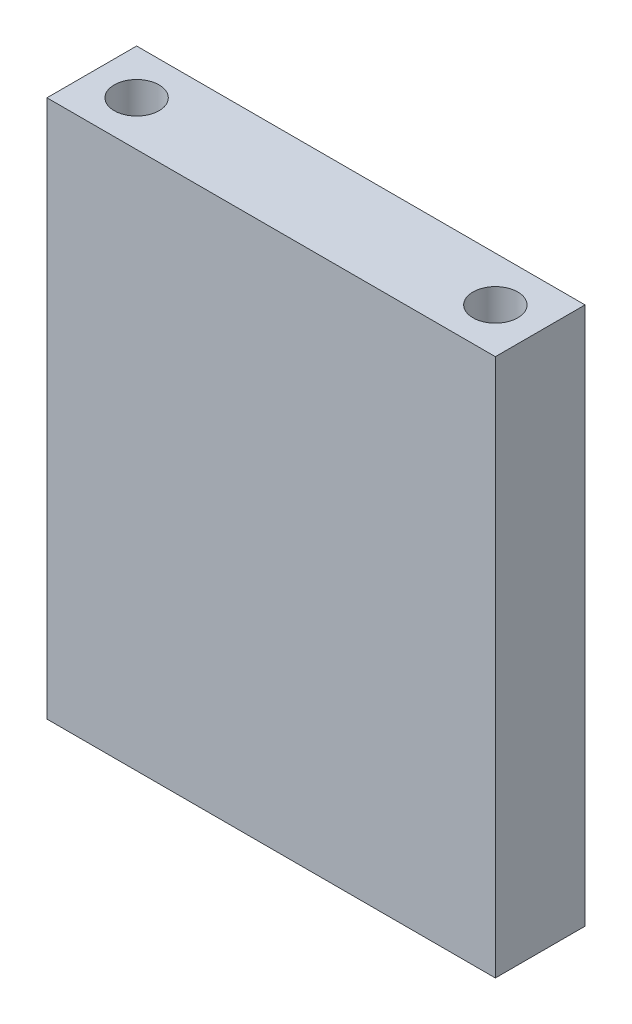
ISO-10303-21;
HEADER;
FILE_DESCRIPTION(('STEP AP214'),'2;1');
FILE_NAME('part.step','',(''),(''),'','','');
FILE_SCHEMA(('AUTOMOTIVE_DESIGN { 1 0 10303 214 1 1 1 1 }'));
ENDSEC;
DATA;
#1=APPLICATION_CONTEXT('core data for automotive mechanical design processes');
#2=APPLICATION_PROTOCOL_DEFINITION('international standard','automotive_design',2000,#1);
#3=PRODUCT_CONTEXT('',#1,'mechanical');
#4=PRODUCT('Part','Part','',(#3));
#5=PRODUCT_RELATED_PRODUCT_CATEGORY('part','',(#4));
#6=PRODUCT_DEFINITION_FORMATION('','',#4);
#7=PRODUCT_DEFINITION_CONTEXT('part definition',#1,'design');
#8=PRODUCT_DEFINITION('design','',#6,#7);
#9=PRODUCT_DEFINITION_SHAPE('','',#8);
#10=(LENGTH_UNIT() NAMED_UNIT(*) SI_UNIT(.MILLI.,.METRE.));
#11=(NAMED_UNIT(*) PLANE_ANGLE_UNIT() SI_UNIT($,.RADIAN.));
#12=(NAMED_UNIT(*) SI_UNIT($,.STERADIAN.) SOLID_ANGLE_UNIT());
#13=UNCERTAINTY_MEASURE_WITH_UNIT(LENGTH_MEASURE(1.E-05),#10,'distance_accuracy_value','');
#14=(GEOMETRIC_REPRESENTATION_CONTEXT(3) GLOBAL_UNCERTAINTY_ASSIGNED_CONTEXT((#13)) GLOBAL_UNIT_ASSIGNED_CONTEXT((#10,
#11,#12)) REPRESENTATION_CONTEXT('',''));
#15=CARTESIAN_POINT('',(0.,0.,0.));
#16=DIRECTION('',(0.,0.,1.));
#17=DIRECTION('',(1.,0.,0.));
#18=AXIS2_PLACEMENT_3D('',#15,#16,#17);
#19=CARTESIAN_POINT('',(12.5,15.,5.));
#20=DIRECTION('',(-1.,0.,0.));
#21=DIRECTION('',(0.,-1.,0.));
#22=AXIS2_PLACEMENT_3D('',#19,#20,#21);
#23=PLANE('',#22);
#24=DIRECTION('',(0.,1.,0.));
#25=VECTOR('',#24,1.);
#26=CARTESIAN_POINT('',(12.5,15.,0.));
#27=LINE('',#26,#25);
#28=CARTESIAN_POINT('',(12.5,-15.,0.));
#29=VERTEX_POINT('',#28);
#30=CARTESIAN_POINT('',(12.5,15.,0.));
#31=VERTEX_POINT('',#30);
#32=EDGE_CURVE('E92',#29,#31,#27,.T.);
#33=ORIENTED_EDGE('',*,*,#32,.T.);
#34=DIRECTION('',(0.,0.,-1.));
#35=VECTOR('',#34,1.);
#36=CARTESIAN_POINT('',(12.5,15.,5.));
#37=LINE('',#36,#35);
#38=CARTESIAN_POINT('',(12.5,15.,5.));
#39=VERTEX_POINT('',#38);
#40=EDGE_CURVE('E11',#39,#31,#37,.T.);
#41=ORIENTED_EDGE('',*,*,#40,.F.);
#42=DIRECTION('',(0.,1.,0.));
#43=VECTOR('',#42,1.);
#44=CARTESIAN_POINT('',(12.5,15.,5.));
#45=LINE('',#44,#43);
#46=CARTESIAN_POINT('',(12.5,-15.,5.));
#47=VERTEX_POINT('',#46);
#48=EDGE_CURVE('E93',#47,#39,#45,.T.);
#49=ORIENTED_EDGE('',*,*,#48,.F.);
#50=DIRECTION('',(0.,0.,-1.));
#51=VECTOR('',#50,1.);
#52=CARTESIAN_POINT('',(12.5,-15.,5.));
#53=LINE('',#52,#51);
#54=EDGE_CURVE('E99',#47,#29,#53,.T.);
#55=ORIENTED_EDGE('',*,*,#54,.T.);
#56=EDGE_LOOP('',(#33,#41,#49,#55));
#57=FACE_BOUND('',#56,.T.);
#58=ADVANCED_FACE('F17',(#57),#23,.F.);
#59=CARTESIAN_POINT('',(-12.5,15.,5.));
#60=DIRECTION('',(0.,-1.,0.));
#61=DIRECTION('',(0.,0.,-1.));
#62=AXIS2_PLACEMENT_3D('',#59,#60,#61);
#63=PLANE('',#62);
#64=CARTESIAN_POINT('',(-10.,15.,2.5));
#65=DIRECTION('',(0.,1.,0.));
#66=DIRECTION('',(0.,0.,1.));
#67=AXIS2_PLACEMENT_3D('',#64,#65,#66);
#68=CIRCLE('',#67,1.25);
#69=CARTESIAN_POINT('',(-10.,15.,3.75));
#70=VERTEX_POINT('',#69);
#71=EDGE_CURVE('E82',#70,#70,#68,.T.);
#72=ORIENTED_EDGE('',*,*,#71,.F.);
#73=EDGE_LOOP('',(#72));
#74=FACE_BOUND('',#73,.T.);
#75=CARTESIAN_POINT('',(10.,15.,2.5));
#76=DIRECTION('',(0.,1.,0.));
#77=DIRECTION('',(0.,0.,1.));
#78=AXIS2_PLACEMENT_3D('',#75,#76,#77);
#79=CIRCLE('',#78,1.25);
#80=CARTESIAN_POINT('',(10.,15.,3.75));
#81=VERTEX_POINT('',#80);
#82=EDGE_CURVE('E81',#81,#81,#79,.T.);
#83=ORIENTED_EDGE('',*,*,#82,.F.);
#84=EDGE_LOOP('',(#83));
#85=FACE_BOUND('',#84,.T.);
#86=DIRECTION('',(-1.,0.,0.));
#87=VECTOR('',#86,1.);
#88=CARTESIAN_POINT('',(-12.5,15.,0.));
#89=LINE('',#88,#87);
#90=CARTESIAN_POINT('',(-12.5,15.,0.));
#91=VERTEX_POINT('',#90);
#92=EDGE_CURVE('E102',#31,#91,#89,.T.);
#93=ORIENTED_EDGE('',*,*,#92,.T.);
#94=DIRECTION('',(0.,0.,-1.));
#95=VECTOR('',#94,1.);
#96=CARTESIAN_POINT('',(-12.5,15.,5.));
#97=LINE('',#96,#95);
#98=CARTESIAN_POINT('',(-12.5,15.,5.));
#99=VERTEX_POINT('',#98);
#100=EDGE_CURVE('E25',#99,#91,#97,.T.);
#101=ORIENTED_EDGE('',*,*,#100,.F.);
#102=DIRECTION('',(-1.,0.,0.));
#103=VECTOR('',#102,1.);
#104=CARTESIAN_POINT('',(-12.5,15.,5.));
#105=LINE('',#104,#103);
#106=EDGE_CURVE('E64',#39,#99,#105,.T.);
#107=ORIENTED_EDGE('',*,*,#106,.F.);
#108=ORIENTED_EDGE('',*,*,#40,.T.);
#109=EDGE_LOOP('',(#93,#101,#107,#108));
#110=FACE_BOUND('',#109,.T.);
#111=ADVANCED_FACE('F127',(#74,#85,#110),#63,.F.);
#112=CARTESIAN_POINT('',(-12.5,15.,5.));
#113=DIRECTION('',(1.,0.,0.));
#114=DIRECTION('',(0.,1.,0.));
#115=AXIS2_PLACEMENT_3D('',#112,#113,#114);
#116=PLANE('',#115);
#117=DIRECTION('',(0.,-1.,0.));
#118=VECTOR('',#117,1.);
#119=CARTESIAN_POINT('',(-12.5,15.,0.));
#120=LINE('',#119,#118);
#121=CARTESIAN_POINT('',(-12.5,-15.,0.));
#122=VERTEX_POINT('',#121);
#123=EDGE_CURVE('E51',#91,#122,#120,.T.);
#124=ORIENTED_EDGE('',*,*,#123,.T.);
#125=DIRECTION('',(0.,0.,-1.));
#126=VECTOR('',#125,1.);
#127=CARTESIAN_POINT('',(-12.5,-15.,5.));
#128=LINE('',#127,#126);
#129=CARTESIAN_POINT('',(-12.5,-15.,5.));
#130=VERTEX_POINT('',#129);
#131=EDGE_CURVE('E107',#130,#122,#128,.T.);
#132=ORIENTED_EDGE('',*,*,#131,.F.);
#133=DIRECTION('',(0.,-1.,0.));
#134=VECTOR('',#133,1.);
#135=CARTESIAN_POINT('',(-12.5,15.,5.));
#136=LINE('',#135,#134);
#137=EDGE_CURVE('E96',#99,#130,#136,.T.);
#138=ORIENTED_EDGE('',*,*,#137,.F.);
#139=ORIENTED_EDGE('',*,*,#100,.T.);
#140=EDGE_LOOP('',(#124,#132,#138,#139));
#141=FACE_BOUND('',#140,.T.);
#142=ADVANCED_FACE('F109',(#141),#116,.F.);
#143=CARTESIAN_POINT('',(-12.5,-15.,5.));
#144=DIRECTION('',(0.,1.,0.));
#145=DIRECTION('',(0.,0.,1.));
#146=AXIS2_PLACEMENT_3D('',#143,#144,#145);
#147=PLANE('',#146);
#148=DIRECTION('',(1.,0.,0.));
#149=VECTOR('',#148,1.);
#150=CARTESIAN_POINT('',(-12.5,-15.,0.));
#151=LINE('',#150,#149);
#152=EDGE_CURVE('E57',#122,#29,#151,.T.);
#153=ORIENTED_EDGE('',*,*,#152,.T.);
#154=ORIENTED_EDGE('',*,*,#54,.F.);
#155=DIRECTION('',(1.,0.,0.));
#156=VECTOR('',#155,1.);
#157=CARTESIAN_POINT('',(-12.5,-15.,5.));
#158=LINE('',#157,#156);
#159=EDGE_CURVE('E33',#130,#47,#158,.T.);
#160=ORIENTED_EDGE('',*,*,#159,.F.);
#161=ORIENTED_EDGE('',*,*,#131,.T.);
#162=EDGE_LOOP('',(#153,#154,#160,#161));
#163=FACE_BOUND('',#162,.T.);
#164=ADVANCED_FACE('F116',(#163),#147,.F.);
#165=CARTESIAN_POINT('',(0.,0.,5.));
#166=DIRECTION('',(0.,0.,1.));
#167=DIRECTION('',(1.,0.,0.));
#168=AXIS2_PLACEMENT_3D('',#165,#166,#167);
#169=PLANE('',#168);
#170=ORIENTED_EDGE('',*,*,#48,.T.);
#171=ORIENTED_EDGE('',*,*,#106,.T.);
#172=ORIENTED_EDGE('',*,*,#137,.T.);
#173=ORIENTED_EDGE('',*,*,#159,.T.);
#174=EDGE_LOOP('',(#170,#171,#172,#173));
#175=FACE_BOUND('',#174,.T.);
#176=ADVANCED_FACE('F118',(#175),#169,.T.);
#177=CARTESIAN_POINT('',(0.,0.,0.));
#178=DIRECTION('',(0.,0.,1.));
#179=DIRECTION('',(1.,0.,0.));
#180=AXIS2_PLACEMENT_3D('',#177,#178,#179);
#181=PLANE('',#180);
#182=ORIENTED_EDGE('',*,*,#32,.F.);
#183=ORIENTED_EDGE('',*,*,#152,.F.);
#184=ORIENTED_EDGE('',*,*,#123,.F.);
#185=ORIENTED_EDGE('',*,*,#92,.F.);
#186=EDGE_LOOP('',(#182,#183,#184,#185));
#187=FACE_BOUND('',#186,.T.);
#188=ADVANCED_FACE('F112',(#187),#181,.F.);
#189=CARTESIAN_POINT('',(10.,3.,2.5));
#190=DIRECTION('',(0.,1.,0.));
#191=DIRECTION('',(0.,0.,1.));
#192=AXIS2_PLACEMENT_3D('',#189,#190,#191);
#193=CONICAL_SURFACE('',#192,1.25,1.02974425867665);
#194=CARTESIAN_POINT('',(10.,2.24892422621556,2.5));
#195=VERTEX_POINT('',#194);
#196=VERTEX_LOOP('',#195);
#197=FACE_BOUND('',#196,.T.);
#198=CARTESIAN_POINT('',(10.,3.,2.5));
#199=DIRECTION('',(0.,1.,0.));
#200=DIRECTION('',(0.,0.,1.));
#201=AXIS2_PLACEMENT_3D('',#198,#199,#200);
#202=CIRCLE('',#201,1.25);
#203=CARTESIAN_POINT('',(10.,3.,3.75));
#204=VERTEX_POINT('',#203);
#205=EDGE_CURVE('E85',#204,#204,#202,.T.);
#206=ORIENTED_EDGE('',*,*,#205,.T.);
#207=EDGE_LOOP('',(#206));
#208=FACE_BOUND('',#207,.T.);
#209=ADVANCED_FACE('F144',(#197,#208),#193,.F.);
#210=CARTESIAN_POINT('',(10.,15.,2.5));
#211=DIRECTION('',(0.,1.,0.));
#212=DIRECTION('',(0.,0.,1.));
#213=AXIS2_PLACEMENT_3D('',#210,#211,#212);
#214=CYLINDRICAL_SURFACE('',#213,1.25);
#215=ORIENTED_EDGE('',*,*,#205,.F.);
#216=EDGE_LOOP('',(#215));
#217=FACE_BOUND('',#216,.T.);
#218=ORIENTED_EDGE('',*,*,#82,.T.);
#219=EDGE_LOOP('',(#218));
#220=FACE_BOUND('',#219,.T.);
#221=ADVANCED_FACE('F75',(#217,#220),#214,.F.);
#222=CARTESIAN_POINT('',(-10.,3.,2.5));
#223=DIRECTION('',(0.,1.,0.));
#224=DIRECTION('',(0.,0.,1.));
#225=AXIS2_PLACEMENT_3D('',#222,#223,#224);
#226=CONICAL_SURFACE('',#225,1.25,1.02974425867665);
#227=CARTESIAN_POINT('',(-10.,2.24892422621556,2.5));
#228=VERTEX_POINT('',#227);
#229=VERTEX_LOOP('',#228);
#230=FACE_BOUND('',#229,.T.);
#231=CARTESIAN_POINT('',(-10.,3.,2.5));
#232=DIRECTION('',(0.,1.,0.));
#233=DIRECTION('',(0.,0.,1.));
#234=AXIS2_PLACEMENT_3D('',#231,#232,#233);
#235=CIRCLE('',#234,1.25);
#236=CARTESIAN_POINT('',(-10.,3.,3.75));
#237=VERTEX_POINT('',#236);
#238=EDGE_CURVE('E79',#237,#237,#235,.T.);
#239=ORIENTED_EDGE('',*,*,#238,.T.);
#240=EDGE_LOOP('',(#239));
#241=FACE_BOUND('',#240,.T.);
#242=ADVANCED_FACE('F71',(#230,#241),#226,.F.);
#243=CARTESIAN_POINT('',(-10.,15.,2.5));
#244=DIRECTION('',(0.,1.,0.));
#245=DIRECTION('',(0.,0.,1.));
#246=AXIS2_PLACEMENT_3D('',#243,#244,#245);
#247=CYLINDRICAL_SURFACE('',#246,1.25);
#248=ORIENTED_EDGE('',*,*,#238,.F.);
#249=EDGE_LOOP('',(#248));
#250=FACE_BOUND('',#249,.T.);
#251=ORIENTED_EDGE('',*,*,#71,.T.);
#252=EDGE_LOOP('',(#251));
#253=FACE_BOUND('',#252,.T.);
#254=ADVANCED_FACE('F74',(#250,#253),#247,.F.);
#255=CLOSED_SHELL('',(#58,#111,#142,#164,#176,#188,#209,#221,#242,#254));
#256=MANIFOLD_SOLID_BREP('B1',#255);
#257=ADVANCED_BREP_SHAPE_REPRESENTATION('',(#18,#256),#14);
#258=SHAPE_DEFINITION_REPRESENTATION(#9,#257);
ENDSEC;
END-ISO-10303-21;
